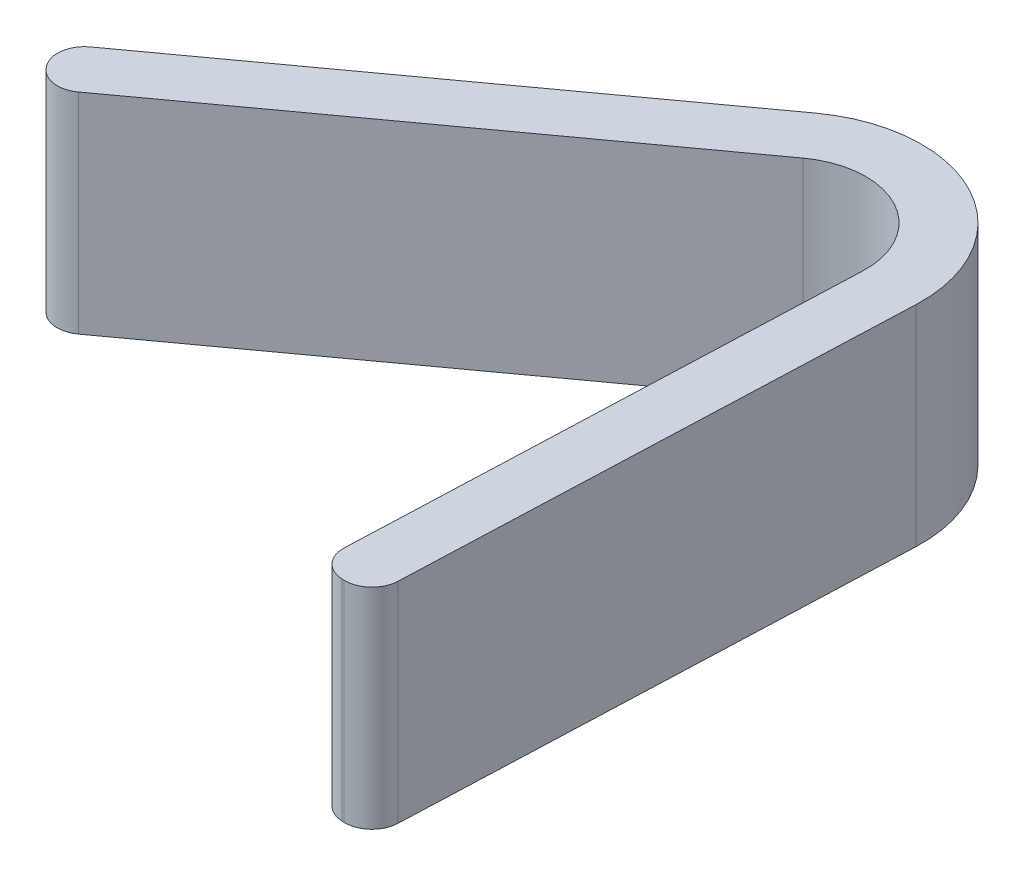
ISO-10303-21;
HEADER;
FILE_DESCRIPTION(('STEP AP214'),'2;1');
FILE_NAME('part.step','',(''),(''),'','','');
FILE_SCHEMA(('AUTOMOTIVE_DESIGN { 1 0 10303 214 1 1 1 1 }'));
ENDSEC;
DATA;
#1=APPLICATION_CONTEXT('core data for automotive mechanical design processes');
#2=APPLICATION_PROTOCOL_DEFINITION('international standard','automotive_design',2000,#1);
#3=PRODUCT_CONTEXT('',#1,'mechanical');
#4=PRODUCT('Part','Part','',(#3));
#5=PRODUCT_RELATED_PRODUCT_CATEGORY('part','',(#4));
#6=PRODUCT_DEFINITION_FORMATION('','',#4);
#7=PRODUCT_DEFINITION_CONTEXT('part definition',#1,'design');
#8=PRODUCT_DEFINITION('design','',#6,#7);
#9=PRODUCT_DEFINITION_SHAPE('','',#8);
#10=(LENGTH_UNIT() NAMED_UNIT(*) SI_UNIT(.MILLI.,.METRE.));
#11=(NAMED_UNIT(*) PLANE_ANGLE_UNIT() SI_UNIT($,.RADIAN.));
#12=(NAMED_UNIT(*) SI_UNIT($,.STERADIAN.) SOLID_ANGLE_UNIT());
#13=UNCERTAINTY_MEASURE_WITH_UNIT(LENGTH_MEASURE(1.E-05),#10,'distance_accuracy_value','');
#14=(GEOMETRIC_REPRESENTATION_CONTEXT(3) GLOBAL_UNCERTAINTY_ASSIGNED_CONTEXT((#13)) GLOBAL_UNIT_ASSIGNED_CONTEXT((#10,
#11,#12)) REPRESENTATION_CONTEXT('',''));
#15=CARTESIAN_POINT('',(0.,0.,0.));
#16=DIRECTION('',(0.,0.,1.));
#17=DIRECTION('',(1.,0.,0.));
#18=AXIS2_PLACEMENT_3D('',#15,#16,#17);
#19=CARTESIAN_POINT('',(94.6423904473408,-31.,326.227862306216));
#20=DIRECTION('',(-0.588062941777262,0.,-0.808815168322326));
#21=DIRECTION('',(-0.808815168322326,0.,0.588062941777262));
#22=AXIS2_PLACEMENT_3D('',#19,#20,#21);
#23=PLANE('',#22);
#24=DIRECTION('',(-0.808815168322326,0.,0.588062941777262));
#25=VECTOR('',#24,1.);
#26=CARTESIAN_POINT('',(94.6423904473408,-31.,326.227862306216));
#27=LINE('',#26,#25);
#28=CARTESIAN_POINT('',(94.6423904473408,-31.,326.227862306216));
#29=VERTEX_POINT('',#28);
#30=CARTESIAN_POINT('',(-29.468872805762,-31.,416.465085141317));
#31=VERTEX_POINT('',#30);
#32=EDGE_CURVE('E152',#29,#31,#27,.T.);
#33=ORIENTED_EDGE('',*,*,#32,.T.);
#34=DIRECTION('',(0.,1.,0.));
#35=VECTOR('',#34,1.);
#36=CARTESIAN_POINT('',(-29.468872805762,31.,416.465085141317));
#37=LINE('',#36,#35);
#38=CARTESIAN_POINT('',(-29.468872805762,31.,416.465085141317));
#39=VERTEX_POINT('',#38);
#40=EDGE_CURVE('E208',#31,#39,#37,.T.);
#41=ORIENTED_EDGE('',*,*,#40,.T.);
#42=DIRECTION('',(-0.808815168322326,0.,0.588062941777262));
#43=VECTOR('',#42,1.);
#44=CARTESIAN_POINT('',(94.6423904473408,31.,326.227862306216));
#45=LINE('',#44,#43);
#46=CARTESIAN_POINT('',(94.6423904473408,31.,326.227862306216));
#47=VERTEX_POINT('',#46);
#48=EDGE_CURVE('E163',#47,#39,#45,.T.);
#49=ORIENTED_EDGE('',*,*,#48,.F.);
#50=DIRECTION('',(0.,1.,0.));
#51=VECTOR('',#50,1.);
#52=CARTESIAN_POINT('',(94.6423904473408,-31.,326.227862306216));
#53=LINE('',#52,#51);
#54=EDGE_CURVE('E181',#29,#47,#53,.T.);
#55=ORIENTED_EDGE('',*,*,#54,.F.);
#56=EDGE_LOOP('',(#33,#41,#49,#55));
#57=FACE_BOUND('',#56,.T.);
#58=ADVANCED_FACE('F34',(#57),#23,.T.);
#59=CARTESIAN_POINT('',(118.311923853876,-31.,358.782672831189));
#60=DIRECTION('',(0.,1.,0.));
#61=DIRECTION('',(0.,0.,1.));
#62=AXIS2_PLACEMENT_3D('',#59,#60,#61);
#63=CYLINDRICAL_SURFACE('',#62,40.2499999999999);
#64=CARTESIAN_POINT('',(118.311923853876,31.,358.782672831189));
#65=DIRECTION('',(0.,1.,0.));
#66=DIRECTION('',(1.,0.,0.));
#67=AXIS2_PLACEMENT_3D('',#64,#65,#66);
#68=CIRCLE('',#67,40.2499999999999);
#69=CARTESIAN_POINT('',(158.531471217051,31.,360.348083288945));
#70=VERTEX_POINT('',#69);
#71=EDGE_CURVE('E178',#70,#47,#68,.T.);
#72=ORIENTED_EDGE('',*,*,#71,.F.);
#73=DIRECTION('',(0.,1.,0.));
#74=VECTOR('',#73,1.);
#75=CARTESIAN_POINT('',(158.531471217051,-31.,360.348083288945));
#76=LINE('',#75,#74);
#77=CARTESIAN_POINT('',(158.531471217051,-31.,360.348083288945));
#78=VERTEX_POINT('',#77);
#79=EDGE_CURVE('E184',#78,#70,#76,.T.);
#80=ORIENTED_EDGE('',*,*,#79,.F.);
#81=CARTESIAN_POINT('',(118.311923853876,-31.,358.782672831189));
#82=DIRECTION('',(0.,1.,0.));
#83=DIRECTION('',(1.,0.,0.));
#84=AXIS2_PLACEMENT_3D('',#81,#82,#83);
#85=CIRCLE('',#84,40.2499999999999);
#86=EDGE_CURVE('E144',#78,#29,#85,.T.);
#87=ORIENTED_EDGE('',*,*,#86,.T.);
#88=ORIENTED_EDGE('',*,*,#54,.T.);
#89=EDGE_LOOP('',(#72,#80,#87,#88));
#90=FACE_BOUND('',#89,.T.);
#91=ADVANCED_FACE('F252',(#90),#63,.T.);
#92=CARTESIAN_POINT('',(152.789692074855,-31.,507.869621179794));
#93=DIRECTION('',(0.999243412749712,0.,0.038892185285842));
#94=DIRECTION('',(0.038892185285842,0.,-0.999243412749712));
#95=AXIS2_PLACEMENT_3D('',#92,#93,#94);
#96=PLANE('',#95);
#97=DIRECTION('',(0.038892185285842,0.,-0.999243412749712));
#98=VECTOR('',#97,1.);
#99=CARTESIAN_POINT('',(152.789692074855,31.,507.869621179794));
#100=LINE('',#99,#98);
#101=CARTESIAN_POINT('',(152.789692074855,31.,507.869621179794));
#102=VERTEX_POINT('',#101);
#103=EDGE_CURVE('E176',#102,#70,#100,.T.);
#104=ORIENTED_EDGE('',*,*,#103,.F.);
#105=DIRECTION('',(0.,1.,0.));
#106=VECTOR('',#105,1.);
#107=CARTESIAN_POINT('',(152.789692074855,-31.,507.869621179794));
#108=LINE('',#107,#106);
#109=CARTESIAN_POINT('',(152.789692074855,-31.,507.869621179794));
#110=VERTEX_POINT('',#109);
#111=EDGE_CURVE('E42',#102,#110,#108,.F.);
#112=ORIENTED_EDGE('',*,*,#111,.T.);
#113=DIRECTION('',(0.0388921852858406,0.,-0.999243412749712));
#114=VECTOR('',#113,1.);
#115=CARTESIAN_POINT('',(152.789692074855,-31.,507.869621179794));
#116=LINE('',#115,#114);
#117=EDGE_CURVE('E159',#110,#78,#116,.T.);
#118=ORIENTED_EDGE('',*,*,#117,.T.);
#119=ORIENTED_EDGE('',*,*,#79,.T.);
#120=EDGE_LOOP('',(#104,#112,#118,#119));
#121=FACE_BOUND('',#120,.T.);
#122=ADVANCED_FACE('F218',(#121),#96,.T.);
#123=CARTESIAN_POINT('',(152.478554592568,-31.,515.863568481792));
#124=DIRECTION('',(0.0388921852858346,0.,-0.999243412749713));
#125=DIRECTION('',(-0.999243412749713,0.,-0.0388921852858346));
#126=AXIS2_PLACEMENT_3D('',#123,#124,#125);
#127=PLANE('',#126);
#128=DIRECTION('',(-0.999243412749713,0.,-0.0388921852858346));
#129=VECTOR('',#128,1.);
#130=CARTESIAN_POINT('',(152.478554592568,-31.,515.863568481792));
#131=LINE('',#130,#129);
#132=CARTESIAN_POINT('',(144.484607290571,-31.,515.552430999505));
#133=VERTEX_POINT('',#132);
#134=CARTESIAN_POINT('',(143.984985584196,-31.,515.532984906862));
#135=VERTEX_POINT('',#134);
#136=EDGE_CURVE('E157',#133,#135,#131,.T.);
#137=ORIENTED_EDGE('',*,*,#136,.F.);
#138=DIRECTION('',(0.,1.,0.));
#139=VECTOR('',#138,1.);
#140=CARTESIAN_POINT('',(144.484607290571,31.,515.552430999505));
#141=LINE('',#140,#139);
#142=CARTESIAN_POINT('',(144.484607290571,31.,515.552430999505));
#143=VERTEX_POINT('',#142);
#144=EDGE_CURVE('E212',#133,#143,#141,.T.);
#145=ORIENTED_EDGE('',*,*,#144,.T.);
#146=DIRECTION('',(-0.999243412749713,0.,-0.0388921852858346));
#147=VECTOR('',#146,1.);
#148=CARTESIAN_POINT('',(152.478554592568,31.,515.863568481792));
#149=LINE('',#148,#147);
#150=CARTESIAN_POINT('',(143.984985584196,31.,515.532984906862));
#151=VERTEX_POINT('',#150);
#152=EDGE_CURVE('E174',#143,#151,#149,.T.);
#153=ORIENTED_EDGE('',*,*,#152,.T.);
#154=DIRECTION('',(0.,1.,0.));
#155=VECTOR('',#154,1.);
#156=CARTESIAN_POINT('',(143.984985584196,-31.,515.532984906862));
#157=LINE('',#156,#155);
#158=EDGE_CURVE('E57',#151,#135,#157,.F.);
#159=ORIENTED_EDGE('',*,*,#158,.T.);
#160=EDGE_LOOP('',(#137,#145,#153,#159));
#161=FACE_BOUND('',#160,.T.);
#162=ADVANCED_FACE('F227',(#161),#127,.F.);
#163=CARTESIAN_POINT('',(136.302175764485,-31.,507.227900122578));
#164=DIRECTION('',(0.999243412749712,0.,0.0388921852858406));
#165=DIRECTION('',(0.0388921852858406,0.,-0.999243412749712));
#166=AXIS2_PLACEMENT_3D('',#163,#164,#165);
#167=PLANE('',#166);
#168=DIRECTION('',(0.038892185285842,0.,-0.999243412749712));
#169=VECTOR('',#168,1.);
#170=CARTESIAN_POINT('',(136.302175764485,-31.,507.227900122577));
#171=LINE('',#170,#169);
#172=CARTESIAN_POINT('',(136.302175764485,-31.,507.227900122578));
#173=VERTEX_POINT('',#172);
#174=CARTESIAN_POINT('',(142.043954906681,-31.,359.706362231728));
#175=VERTEX_POINT('',#174);
#176=EDGE_CURVE('E130',#173,#175,#171,.T.);
#177=ORIENTED_EDGE('',*,*,#176,.F.);
#178=DIRECTION('',(0.,1.,0.));
#179=VECTOR('',#178,1.);
#180=CARTESIAN_POINT('',(136.302175764485,-31.,507.227900122578));
#181=LINE('',#180,#179);
#182=CARTESIAN_POINT('',(136.302175764485,31.,507.227900122578));
#183=VERTEX_POINT('',#182);
#184=EDGE_CURVE('E11',#173,#183,#181,.T.);
#185=ORIENTED_EDGE('',*,*,#184,.T.);
#186=DIRECTION('',(0.0388921852858406,0.,-0.999243412749712));
#187=VECTOR('',#186,1.);
#188=CARTESIAN_POINT('',(136.302175764485,31.,507.227900122578));
#189=LINE('',#188,#187);
#190=CARTESIAN_POINT('',(142.043954906681,31.,359.706362231728));
#191=VERTEX_POINT('',#190);
#192=EDGE_CURVE('E172',#183,#191,#189,.T.);
#193=ORIENTED_EDGE('',*,*,#192,.T.);
#194=DIRECTION('',(0.,1.,0.));
#195=VECTOR('',#194,1.);
#196=CARTESIAN_POINT('',(142.043954906681,-31.,359.706362231728));
#197=LINE('',#196,#195);
#198=EDGE_CURVE('E143',#175,#191,#197,.T.);
#199=ORIENTED_EDGE('',*,*,#198,.F.);
#200=EDGE_LOOP('',(#177,#185,#193,#199));
#201=FACE_BOUND('',#200,.T.);
#202=ADVANCED_FACE('F235',(#201),#167,.F.);
#203=CARTESIAN_POINT('',(118.311923853876,-31.,358.782672831189));
#204=DIRECTION('',(0.,1.,0.));
#205=DIRECTION('',(0.,0.,1.));
#206=AXIS2_PLACEMENT_3D('',#203,#204,#205);
#207=CYLINDRICAL_SURFACE('',#206,23.7499999999999);
#208=CARTESIAN_POINT('',(118.311923853876,31.,358.782672831189));
#209=DIRECTION('',(0.,1.,0.));
#210=DIRECTION('',(1.,0.,0.));
#211=AXIS2_PLACEMENT_3D('',#208,#209,#210);
#212=CIRCLE('',#211,23.7499999999999);
#213=CARTESIAN_POINT('',(104.345428986666,31.,339.573312583534));
#214=VERTEX_POINT('',#213);
#215=EDGE_CURVE('E139',#191,#214,#212,.T.);
#216=ORIENTED_EDGE('',*,*,#215,.T.);
#217=DIRECTION('',(0.,1.,0.));
#218=VECTOR('',#217,1.);
#219=CARTESIAN_POINT('',(104.345428986666,-31.,339.573312583534));
#220=LINE('',#219,#218);
#221=CARTESIAN_POINT('',(104.345428986666,-31.,339.573312583534));
#222=VERTEX_POINT('',#221);
#223=EDGE_CURVE('E136',#222,#214,#220,.T.);
#224=ORIENTED_EDGE('',*,*,#223,.F.);
#225=CARTESIAN_POINT('',(118.311923853876,-31.,358.782672831189));
#226=DIRECTION('',(0.,1.,0.));
#227=DIRECTION('',(1.,0.,0.));
#228=AXIS2_PLACEMENT_3D('',#225,#226,#227);
#229=CIRCLE('',#228,23.7499999999999);
#230=EDGE_CURVE('E124',#175,#222,#229,.T.);
#231=ORIENTED_EDGE('',*,*,#230,.F.);
#232=ORIENTED_EDGE('',*,*,#198,.T.);
#233=EDGE_LOOP('',(#216,#224,#231,#232));
#234=FACE_BOUND('',#233,.T.);
#235=ADVANCED_FACE('F137',(#234),#207,.F.);
#236=CARTESIAN_POINT('',(104.345428986666,-31.,339.573312583534));
#237=DIRECTION('',(-0.588062941777262,0.,-0.808815168322326));
#238=DIRECTION('',(-0.808815168322326,0.,0.588062941777262));
#239=AXIS2_PLACEMENT_3D('',#236,#237,#238);
#240=PLANE('',#239);
#241=DIRECTION('',(-0.808815168322326,0.,0.588062941777262));
#242=VECTOR('',#241,1.);
#243=CARTESIAN_POINT('',(104.345428986666,31.,339.573312583534));
#244=LINE('',#243,#242);
#245=CARTESIAN_POINT('',(-19.7658342664372,31.,429.810535418636));
#246=VERTEX_POINT('',#245);
#247=EDGE_CURVE('E169',#214,#246,#244,.T.);
#248=ORIENTED_EDGE('',*,*,#247,.T.);
#249=DIRECTION('',(0.,1.,0.));
#250=VECTOR('',#249,1.);
#251=CARTESIAN_POINT('',(-19.7658342664371,-31.,429.810535418636));
#252=LINE('',#251,#250);
#253=CARTESIAN_POINT('',(-19.7658342664372,-31.,429.810535418636));
#254=VERTEX_POINT('',#253);
#255=EDGE_CURVE('E148',#246,#254,#252,.F.);
#256=ORIENTED_EDGE('',*,*,#255,.T.);
#257=DIRECTION('',(-0.808815168322326,0.,0.588062941777262));
#258=VECTOR('',#257,1.);
#259=CARTESIAN_POINT('',(104.345428986666,-31.,339.573312583534));
#260=LINE('',#259,#258);
#261=EDGE_CURVE('E128',#222,#254,#260,.T.);
#262=ORIENTED_EDGE('',*,*,#261,.F.);
#263=ORIENTED_EDGE('',*,*,#223,.T.);
#264=EDGE_LOOP('',(#248,#256,#262,#263));
#265=FACE_BOUND('',#264,.T.);
#266=ADVANCED_FACE('F146',(#265),#240,.F.);
#267=CARTESIAN_POINT('',(-26.2363556130157,-31.,434.515038952854));
#268=DIRECTION('',(0.808815168322326,0.,-0.588062941777263));
#269=DIRECTION('',(-0.588062941777263,0.,-0.808815168322326));
#270=AXIS2_PLACEMENT_3D('',#267,#268,#269);
#271=PLANE('',#270);
#272=DIRECTION('',(-0.588062941777262,0.,-0.808815168322325));
#273=VECTOR('',#272,1.);
#274=CARTESIAN_POINT('',(-26.2363556130157,-31.,434.515038952854));
#275=LINE('',#274,#273);
#276=CARTESIAN_POINT('',(-30.9408591472338,-31.,428.044517606275));
#277=VERTEX_POINT('',#276);
#278=CARTESIAN_POINT('',(-31.2348906181224,-31.,427.640110022114));
#279=VERTEX_POINT('',#278);
#280=EDGE_CURVE('E149',#277,#279,#275,.T.);
#281=ORIENTED_EDGE('',*,*,#280,.F.);
#282=DIRECTION('',(0.,1.,0.));
#283=VECTOR('',#282,1.);
#284=CARTESIAN_POINT('',(-30.9408591472338,-31.,428.044517606275));
#285=LINE('',#284,#283);
#286=CARTESIAN_POINT('',(-30.9408591472338,31.,428.044517606275));
#287=VERTEX_POINT('',#286);
#288=EDGE_CURVE('E189',#277,#287,#285,.T.);
#289=ORIENTED_EDGE('',*,*,#288,.T.);
#290=DIRECTION('',(-0.588062941777262,0.,-0.808815168322325));
#291=VECTOR('',#290,1.);
#292=CARTESIAN_POINT('',(-26.2363556130157,31.,434.515038952854));
#293=LINE('',#292,#291);
#294=CARTESIAN_POINT('',(-31.2348906181224,31.,427.640110022114));
#295=VERTEX_POINT('',#294);
#296=EDGE_CURVE('E166',#287,#295,#293,.T.);
#297=ORIENTED_EDGE('',*,*,#296,.T.);
#298=DIRECTION('',(0.,1.,0.));
#299=VECTOR('',#298,1.);
#300=CARTESIAN_POINT('',(-31.2348906181224,-31.,427.640110022114));
#301=LINE('',#300,#299);
#302=EDGE_CURVE('E183',#295,#279,#301,.F.);
#303=ORIENTED_EDGE('',*,*,#302,.T.);
#304=EDGE_LOOP('',(#281,#289,#297,#303));
#305=FACE_BOUND('',#304,.T.);
#306=ADVANCED_FACE('F242',(#305),#271,.F.);
#307=CARTESIAN_POINT('',(118.311923853876,-31.,358.782672831189));
#308=DIRECTION('',(0.,1.,0.));
#309=DIRECTION('',(1.,0.,0.));
#310=AXIS2_PLACEMENT_3D('',#307,#308,#309);
#311=PLANE('',#310);
#312=ORIENTED_EDGE('',*,*,#261,.T.);
#313=CARTESIAN_POINT('',(-24.4703378006552,-31.,423.340014072057));
#314=DIRECTION('',(0.,1.,0.));
#315=DIRECTION('',(0.,0.,1.));
#316=AXIS2_PLACEMENT_3D('',#313,#314,#315);
#317=CIRCLE('',#316,8.);
#318=EDGE_CURVE('E206',#254,#277,#317,.F.);
#319=ORIENTED_EDGE('',*,*,#318,.T.);
#320=ORIENTED_EDGE('',*,*,#280,.T.);
#321=CARTESIAN_POINT('',(-24.7643692715438,-31.,422.935606487896));
#322=DIRECTION('',(0.,1.,0.));
#323=DIRECTION('',(0.,0.,1.));
#324=AXIS2_PLACEMENT_3D('',#321,#322,#323);
#325=CIRCLE('',#324,8.);
#326=EDGE_CURVE('E204',#279,#31,#325,.F.);
#327=ORIENTED_EDGE('',*,*,#326,.T.);
#328=ORIENTED_EDGE('',*,*,#32,.F.);
#329=ORIENTED_EDGE('',*,*,#86,.F.);
#330=ORIENTED_EDGE('',*,*,#117,.F.);
#331=CARTESIAN_POINT('',(144.795744772857,-31.,507.558483697507));
#332=DIRECTION('',(0.,1.,0.));
#333=DIRECTION('',(0.,0.,1.));
#334=AXIS2_PLACEMENT_3D('',#331,#332,#333);
#335=CIRCLE('',#334,8.);
#336=EDGE_CURVE('E202',#110,#133,#335,.F.);
#337=ORIENTED_EDGE('',*,*,#336,.T.);
#338=ORIENTED_EDGE('',*,*,#136,.T.);
#339=CARTESIAN_POINT('',(144.296123066483,-31.,507.539037604864));
#340=DIRECTION('',(0.,1.,0.));
#341=DIRECTION('',(0.,0.,1.));
#342=AXIS2_PLACEMENT_3D('',#339,#340,#341);
#343=CIRCLE('',#342,8.);
#344=EDGE_CURVE('E49',#135,#173,#343,.F.);
#345=ORIENTED_EDGE('',*,*,#344,.T.);
#346=ORIENTED_EDGE('',*,*,#176,.T.);
#347=ORIENTED_EDGE('',*,*,#230,.T.);
#348=EDGE_LOOP('',(#312,#319,#320,#327,#328,#329,#330,#337,#338,#345,#346,#347));
#349=FACE_BOUND('',#348,.T.);
#350=ADVANCED_FACE('F126',(#349),#311,.F.);
#351=CARTESIAN_POINT('',(118.311923853876,31.,358.782672831189));
#352=DIRECTION('',(0.,1.,0.));
#353=DIRECTION('',(1.,0.,0.));
#354=AXIS2_PLACEMENT_3D('',#351,#352,#353);
#355=PLANE('',#354);
#356=ORIENTED_EDGE('',*,*,#296,.F.);
#357=CARTESIAN_POINT('',(-24.4703378006552,31.,423.340014072057));
#358=DIRECTION('',(0.,1.,0.));
#359=DIRECTION('',(0.,0.,1.));
#360=AXIS2_PLACEMENT_3D('',#357,#358,#359);
#361=CIRCLE('',#360,8.);
#362=EDGE_CURVE('E198',#287,#246,#361,.T.);
#363=ORIENTED_EDGE('',*,*,#362,.T.);
#364=ORIENTED_EDGE('',*,*,#247,.F.);
#365=ORIENTED_EDGE('',*,*,#215,.F.);
#366=ORIENTED_EDGE('',*,*,#192,.F.);
#367=CARTESIAN_POINT('',(144.296123066483,31.,507.539037604864));
#368=DIRECTION('',(0.,1.,0.));
#369=DIRECTION('',(0.,0.,1.));
#370=AXIS2_PLACEMENT_3D('',#367,#368,#369);
#371=CIRCLE('',#370,8.);
#372=EDGE_CURVE('E192',#183,#151,#371,.T.);
#373=ORIENTED_EDGE('',*,*,#372,.T.);
#374=ORIENTED_EDGE('',*,*,#152,.F.);
#375=CARTESIAN_POINT('',(144.795744772857,31.,507.558483697507));
#376=DIRECTION('',(0.,1.,0.));
#377=DIRECTION('',(0.,0.,1.));
#378=AXIS2_PLACEMENT_3D('',#375,#376,#377);
#379=CIRCLE('',#378,8.);
#380=EDGE_CURVE('E194',#143,#102,#379,.T.);
#381=ORIENTED_EDGE('',*,*,#380,.T.);
#382=ORIENTED_EDGE('',*,*,#103,.T.);
#383=ORIENTED_EDGE('',*,*,#71,.T.);
#384=ORIENTED_EDGE('',*,*,#48,.T.);
#385=CARTESIAN_POINT('',(-24.7643692715438,31.,422.935606487896));
#386=DIRECTION('',(0.,1.,0.));
#387=DIRECTION('',(0.,0.,1.));
#388=AXIS2_PLACEMENT_3D('',#385,#386,#387);
#389=CIRCLE('',#388,8.);
#390=EDGE_CURVE('E196',#39,#295,#389,.T.);
#391=ORIENTED_EDGE('',*,*,#390,.T.);
#392=EDGE_LOOP('',(#356,#363,#364,#365,#366,#373,#374,#381,#382,#383,#384,#391));
#393=FACE_BOUND('',#392,.T.);
#394=ADVANCED_FACE('F230',(#393),#355,.T.);
#395=CARTESIAN_POINT('',(-24.4703378006552,-31.,423.340014072057));
#396=DIRECTION('',(0.,1.,0.));
#397=DIRECTION('',(0.,0.,1.));
#398=AXIS2_PLACEMENT_3D('',#395,#396,#397);
#399=CYLINDRICAL_SURFACE('',#398,8.);
#400=ORIENTED_EDGE('',*,*,#318,.F.);
#401=ORIENTED_EDGE('',*,*,#255,.F.);
#402=ORIENTED_EDGE('',*,*,#362,.F.);
#403=ORIENTED_EDGE('',*,*,#288,.F.);
#404=EDGE_LOOP('',(#400,#401,#402,#403));
#405=FACE_BOUND('',#404,.T.);
#406=ADVANCED_FACE('F237',(#405),#399,.T.);
#407=CARTESIAN_POINT('',(-24.7643692715438,-31.,422.935606487896));
#408=DIRECTION('',(0.,-1.,0.));
#409=DIRECTION('',(0.,0.,-1.));
#410=AXIS2_PLACEMENT_3D('',#407,#408,#409);
#411=CYLINDRICAL_SURFACE('',#410,8.);
#412=ORIENTED_EDGE('',*,*,#326,.F.);
#413=ORIENTED_EDGE('',*,*,#302,.F.);
#414=ORIENTED_EDGE('',*,*,#390,.F.);
#415=ORIENTED_EDGE('',*,*,#40,.F.);
#416=EDGE_LOOP('',(#412,#413,#414,#415));
#417=FACE_BOUND('',#416,.T.);
#418=ADVANCED_FACE('F245',(#417),#411,.T.);
#419=CARTESIAN_POINT('',(144.795744772857,-31.,507.558483697507));
#420=DIRECTION('',(0.,-1.,0.));
#421=DIRECTION('',(0.,0.,-1.));
#422=AXIS2_PLACEMENT_3D('',#419,#420,#421);
#423=CYLINDRICAL_SURFACE('',#422,8.);
#424=ORIENTED_EDGE('',*,*,#336,.F.);
#425=ORIENTED_EDGE('',*,*,#111,.F.);
#426=ORIENTED_EDGE('',*,*,#380,.F.);
#427=ORIENTED_EDGE('',*,*,#144,.F.);
#428=EDGE_LOOP('',(#424,#425,#426,#427));
#429=FACE_BOUND('',#428,.T.);
#430=ADVANCED_FACE('F225',(#429),#423,.T.);
#431=CARTESIAN_POINT('',(144.296123066483,-31.,507.539037604864));
#432=DIRECTION('',(0.,1.,0.));
#433=DIRECTION('',(0.,0.,1.));
#434=AXIS2_PLACEMENT_3D('',#431,#432,#433);
#435=CYLINDRICAL_SURFACE('',#434,8.);
#436=ORIENTED_EDGE('',*,*,#344,.F.);
#437=ORIENTED_EDGE('',*,*,#158,.F.);
#438=ORIENTED_EDGE('',*,*,#372,.F.);
#439=ORIENTED_EDGE('',*,*,#184,.F.);
#440=EDGE_LOOP('',(#436,#437,#438,#439));
#441=FACE_BOUND('',#440,.T.);
#442=ADVANCED_FACE('F36',(#441),#435,.T.);
#443=CLOSED_SHELL('',(#58,#91,#122,#162,#202,#235,#266,#306,#350,#394,#406,#418,#430,#442));
#444=MANIFOLD_SOLID_BREP('B2',#443);
#445=ADVANCED_BREP_SHAPE_REPRESENTATION('',(#18,#444),#14);
#446=SHAPE_DEFINITION_REPRESENTATION(#9,#445);
ENDSEC;
END-ISO-10303-21;
